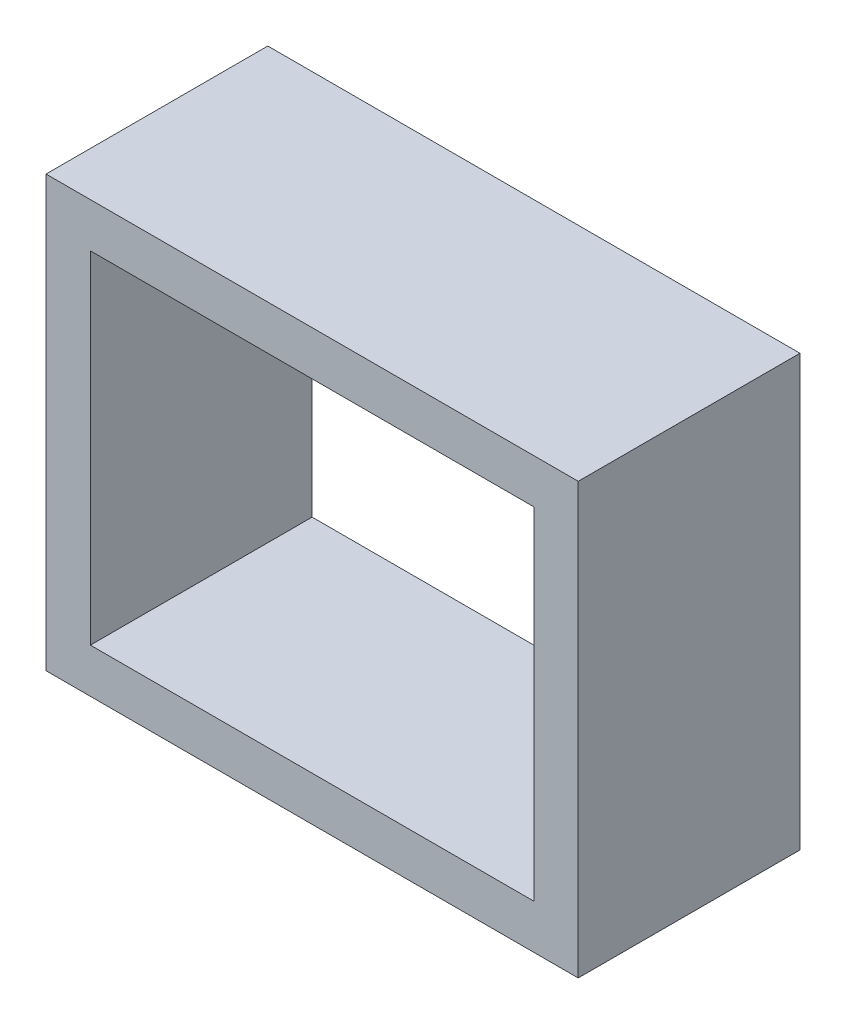
ISO-10303-21;
HEADER;
FILE_DESCRIPTION(('STEP AP214'),'2;1');
FILE_NAME('part.step','',(''),(''),'','','');
FILE_SCHEMA(('AUTOMOTIVE_DESIGN { 1 0 10303 214 1 1 1 1 }'));
ENDSEC;
DATA;
#1=APPLICATION_CONTEXT('core data for automotive mechanical design processes');
#2=APPLICATION_PROTOCOL_DEFINITION('international standard','automotive_design',2000,#1);
#3=PRODUCT_CONTEXT('',#1,'mechanical');
#4=PRODUCT('Part','Part','',(#3));
#5=PRODUCT_RELATED_PRODUCT_CATEGORY('part','',(#4));
#6=PRODUCT_DEFINITION_FORMATION('','',#4);
#7=PRODUCT_DEFINITION_CONTEXT('part definition',#1,'design');
#8=PRODUCT_DEFINITION('design','',#6,#7);
#9=PRODUCT_DEFINITION_SHAPE('','',#8);
#10=(LENGTH_UNIT() NAMED_UNIT(*) SI_UNIT(.MILLI.,.METRE.));
#11=(NAMED_UNIT(*) PLANE_ANGLE_UNIT() SI_UNIT($,.RADIAN.));
#12=(NAMED_UNIT(*) SI_UNIT($,.STERADIAN.) SOLID_ANGLE_UNIT());
#13=UNCERTAINTY_MEASURE_WITH_UNIT(LENGTH_MEASURE(1.E-05),#10,'distance_accuracy_value','');
#14=(GEOMETRIC_REPRESENTATION_CONTEXT(3) GLOBAL_UNCERTAINTY_ASSIGNED_CONTEXT((#13)) GLOBAL_UNIT_ASSIGNED_CONTEXT((#10,
#11,#12)) REPRESENTATION_CONTEXT('',''));
#15=CARTESIAN_POINT('',(0.,0.,0.));
#16=DIRECTION('',(0.,0.,1.));
#17=DIRECTION('',(1.,0.,0.));
#18=AXIS2_PLACEMENT_3D('',#15,#16,#17);
#19=CARTESIAN_POINT('',(0.,0.,50.));
#20=DIRECTION('',(0.,0.,1.));
#21=DIRECTION('',(1.,0.,0.));
#22=AXIS2_PLACEMENT_3D('',#19,#20,#21);
#23=PLANE('',#22);
#24=DIRECTION('',(0.,-1.,0.));
#25=VECTOR('',#24,1.);
#26=CARTESIAN_POINT('',(-60.,36.6666666666667,50.));
#27=LINE('',#26,#25);
#28=CARTESIAN_POINT('',(-60.,46.6666666666667,50.));
#29=VERTEX_POINT('',#28);
#30=CARTESIAN_POINT('',(-60.,-50.3333333333333,50.));
#31=VERTEX_POINT('',#30);
#32=EDGE_CURVE('E157',#29,#31,#27,.T.);
#33=ORIENTED_EDGE('',*,*,#32,.T.);
#34=DIRECTION('',(1.,0.,0.));
#35=VECTOR('',#34,1.);
#36=CARTESIAN_POINT('',(-50.,-50.3333333333333,50.));
#37=LINE('',#36,#35);
#38=CARTESIAN_POINT('',(60.,-50.3333333333333,50.));
#39=VERTEX_POINT('',#38);
#40=EDGE_CURVE('E160',#31,#39,#37,.T.);
#41=ORIENTED_EDGE('',*,*,#40,.T.);
#42=DIRECTION('',(0.,1.,0.));
#43=VECTOR('',#42,1.);
#44=CARTESIAN_POINT('',(60.,36.6666666666667,50.));
#45=LINE('',#44,#43);
#46=CARTESIAN_POINT('',(60.,46.6666666666667,50.));
#47=VERTEX_POINT('',#46);
#48=EDGE_CURVE('E163',#39,#47,#45,.T.);
#49=ORIENTED_EDGE('',*,*,#48,.T.);
#50=DIRECTION('',(-1.,0.,0.));
#51=VECTOR('',#50,1.);
#52=CARTESIAN_POINT('',(-50.,46.6666666666667,50.));
#53=LINE('',#52,#51);
#54=EDGE_CURVE('E165',#47,#29,#53,.T.);
#55=ORIENTED_EDGE('',*,*,#54,.T.);
#56=EDGE_LOOP('',(#33,#41,#49,#55));
#57=FACE_BOUND('',#56,.T.);
#58=DIRECTION('',(1.,0.,0.));
#59=VECTOR('',#58,1.);
#60=CARTESIAN_POINT('',(-50.,-40.3333333333333,50.));
#61=LINE('',#60,#59);
#62=CARTESIAN_POINT('',(-50.,-40.3333333333333,50.));
#63=VERTEX_POINT('',#62);
#64=CARTESIAN_POINT('',(50.,-40.3333333333333,50.));
#65=VERTEX_POINT('',#64);
#66=EDGE_CURVE('E129',#63,#65,#61,.T.);
#67=ORIENTED_EDGE('',*,*,#66,.F.);
#68=DIRECTION('',(0.,-1.,0.));
#69=VECTOR('',#68,1.);
#70=CARTESIAN_POINT('',(-50.,36.6666666666667,50.));
#71=LINE('',#70,#69);
#72=CARTESIAN_POINT('',(-50.,36.6666666666667,50.));
#73=VERTEX_POINT('',#72);
#74=EDGE_CURVE('E121',#73,#63,#71,.T.);
#75=ORIENTED_EDGE('',*,*,#74,.F.);
#76=DIRECTION('',(-1.,0.,0.));
#77=VECTOR('',#76,1.);
#78=CARTESIAN_POINT('',(-50.,36.6666666666667,50.));
#79=LINE('',#78,#77);
#80=CARTESIAN_POINT('',(50.,36.6666666666667,50.));
#81=VERTEX_POINT('',#80);
#82=EDGE_CURVE('E143',#81,#73,#79,.T.);
#83=ORIENTED_EDGE('',*,*,#82,.F.);
#84=DIRECTION('',(0.,1.,0.));
#85=VECTOR('',#84,1.);
#86=CARTESIAN_POINT('',(50.,36.6666666666667,50.));
#87=LINE('',#86,#85);
#88=EDGE_CURVE('E141',#65,#81,#87,.T.);
#89=ORIENTED_EDGE('',*,*,#88,.F.);
#90=EDGE_LOOP('',(#67,#75,#83,#89));
#91=FACE_BOUND('',#90,.T.);
#92=ADVANCED_FACE('F56',(#57,#91),#23,.T.);
#93=CARTESIAN_POINT('',(0.,0.,0.));
#94=DIRECTION('',(0.,0.,1.));
#95=DIRECTION('',(1.,0.,0.));
#96=AXIS2_PLACEMENT_3D('',#93,#94,#95);
#97=PLANE('',#96);
#98=DIRECTION('',(0.,-1.,0.));
#99=VECTOR('',#98,1.);
#100=CARTESIAN_POINT('',(-60.,36.6666666666667,0.));
#101=LINE('',#100,#99);
#102=CARTESIAN_POINT('',(-60.,46.6666666666667,0.));
#103=VERTEX_POINT('',#102);
#104=CARTESIAN_POINT('',(-60.,-50.3333333333333,0.));
#105=VERTEX_POINT('',#104);
#106=EDGE_CURVE('E137',#103,#105,#101,.T.);
#107=ORIENTED_EDGE('',*,*,#106,.F.);
#108=DIRECTION('',(-1.,0.,0.));
#109=VECTOR('',#108,1.);
#110=CARTESIAN_POINT('',(-50.,46.6666666666667,0.));
#111=LINE('',#110,#109);
#112=CARTESIAN_POINT('',(60.,46.6666666666667,0.));
#113=VERTEX_POINT('',#112);
#114=EDGE_CURVE('E161',#113,#103,#111,.T.);
#115=ORIENTED_EDGE('',*,*,#114,.F.);
#116=DIRECTION('',(0.,1.,0.));
#117=VECTOR('',#116,1.);
#118=CARTESIAN_POINT('',(60.,36.6666666666667,0.));
#119=LINE('',#118,#117);
#120=CARTESIAN_POINT('',(60.,-50.3333333333333,0.));
#121=VERTEX_POINT('',#120);
#122=EDGE_CURVE('E172',#121,#113,#119,.T.);
#123=ORIENTED_EDGE('',*,*,#122,.F.);
#124=DIRECTION('',(1.,0.,0.));
#125=VECTOR('',#124,1.);
#126=CARTESIAN_POINT('',(-50.,-50.3333333333333,0.));
#127=LINE('',#126,#125);
#128=EDGE_CURVE('E170',#105,#121,#127,.T.);
#129=ORIENTED_EDGE('',*,*,#128,.F.);
#130=EDGE_LOOP('',(#107,#115,#123,#129));
#131=FACE_BOUND('',#130,.T.);
#132=DIRECTION('',(0.,-1.,0.));
#133=VECTOR('',#132,1.);
#134=CARTESIAN_POINT('',(-50.,36.6666666666667,0.));
#135=LINE('',#134,#133);
#136=CARTESIAN_POINT('',(-50.,36.6666666666667,0.));
#137=VERTEX_POINT('',#136);
#138=CARTESIAN_POINT('',(-50.,-40.3333333333333,0.));
#139=VERTEX_POINT('',#138);
#140=EDGE_CURVE('E79',#137,#139,#135,.T.);
#141=ORIENTED_EDGE('',*,*,#140,.T.);
#142=DIRECTION('',(1.,0.,0.));
#143=VECTOR('',#142,1.);
#144=CARTESIAN_POINT('',(-50.,-40.3333333333333,0.));
#145=LINE('',#144,#143);
#146=CARTESIAN_POINT('',(50.,-40.3333333333333,0.));
#147=VERTEX_POINT('',#146);
#148=EDGE_CURVE('E136',#139,#147,#145,.T.);
#149=ORIENTED_EDGE('',*,*,#148,.T.);
#150=DIRECTION('',(0.,1.,0.));
#151=VECTOR('',#150,1.);
#152=CARTESIAN_POINT('',(50.,36.6666666666667,0.));
#153=LINE('',#152,#151);
#154=CARTESIAN_POINT('',(50.,36.6666666666667,0.));
#155=VERTEX_POINT('',#154);
#156=EDGE_CURVE('E149',#147,#155,#153,.T.);
#157=ORIENTED_EDGE('',*,*,#156,.T.);
#158=DIRECTION('',(-1.,0.,0.));
#159=VECTOR('',#158,1.);
#160=CARTESIAN_POINT('',(-50.,36.6666666666667,0.));
#161=LINE('',#160,#159);
#162=EDGE_CURVE('E130',#155,#137,#161,.T.);
#163=ORIENTED_EDGE('',*,*,#162,.T.);
#164=EDGE_LOOP('',(#141,#149,#157,#163));
#165=FACE_BOUND('',#164,.T.);
#166=ADVANCED_FACE('F190',(#131,#165),#97,.F.);
#167=CARTESIAN_POINT('',(-60.,36.6666666666667,50.));
#168=DIRECTION('',(1.,0.,0.));
#169=DIRECTION('',(0.,1.,0.));
#170=AXIS2_PLACEMENT_3D('',#167,#168,#169);
#171=PLANE('',#170);
#172=ORIENTED_EDGE('',*,*,#106,.T.);
#173=DIRECTION('',(0.,0.,-1.));
#174=VECTOR('',#173,1.);
#175=CARTESIAN_POINT('',(-60.,-50.3333333333333,50.));
#176=LINE('',#175,#174);
#177=EDGE_CURVE('E12',#31,#105,#176,.T.);
#178=ORIENTED_EDGE('',*,*,#177,.F.);
#179=ORIENTED_EDGE('',*,*,#32,.F.);
#180=DIRECTION('',(0.,0.,-1.));
#181=VECTOR('',#180,1.);
#182=CARTESIAN_POINT('',(-60.,46.6666666666667,50.));
#183=LINE('',#182,#181);
#184=EDGE_CURVE('E167',#29,#103,#183,.T.);
#185=ORIENTED_EDGE('',*,*,#184,.T.);
#186=EDGE_LOOP('',(#172,#178,#179,#185));
#187=FACE_BOUND('',#186,.T.);
#188=ADVANCED_FACE('F58',(#187),#171,.F.);
#189=CARTESIAN_POINT('',(-50.,-50.3333333333333,50.));
#190=DIRECTION('',(0.,1.,0.));
#191=DIRECTION('',(0.,0.,1.));
#192=AXIS2_PLACEMENT_3D('',#189,#190,#191);
#193=PLANE('',#192);
#194=ORIENTED_EDGE('',*,*,#128,.T.);
#195=DIRECTION('',(0.,0.,-1.));
#196=VECTOR('',#195,1.);
#197=CARTESIAN_POINT('',(60.,-50.3333333333333,50.));
#198=LINE('',#197,#196);
#199=EDGE_CURVE('E64',#39,#121,#198,.T.);
#200=ORIENTED_EDGE('',*,*,#199,.F.);
#201=ORIENTED_EDGE('',*,*,#40,.F.);
#202=ORIENTED_EDGE('',*,*,#177,.T.);
#203=EDGE_LOOP('',(#194,#200,#201,#202));
#204=FACE_BOUND('',#203,.T.);
#205=ADVANCED_FACE('F200',(#204),#193,.F.);
#206=CARTESIAN_POINT('',(60.,36.6666666666667,50.));
#207=DIRECTION('',(-1.,0.,0.));
#208=DIRECTION('',(0.,-1.,0.));
#209=AXIS2_PLACEMENT_3D('',#206,#207,#208);
#210=PLANE('',#209);
#211=ORIENTED_EDGE('',*,*,#122,.T.);
#212=DIRECTION('',(0.,0.,-1.));
#213=VECTOR('',#212,1.);
#214=CARTESIAN_POINT('',(60.,46.6666666666667,50.));
#215=LINE('',#214,#213);
#216=EDGE_CURVE('E177',#47,#113,#215,.T.);
#217=ORIENTED_EDGE('',*,*,#216,.F.);
#218=ORIENTED_EDGE('',*,*,#48,.F.);
#219=ORIENTED_EDGE('',*,*,#199,.T.);
#220=EDGE_LOOP('',(#211,#217,#218,#219));
#221=FACE_BOUND('',#220,.T.);
#222=ADVANCED_FACE('F184',(#221),#210,.F.);
#223=CARTESIAN_POINT('',(-50.,46.6666666666667,50.));
#224=DIRECTION('',(0.,-1.,0.));
#225=DIRECTION('',(0.,0.,-1.));
#226=AXIS2_PLACEMENT_3D('',#223,#224,#225);
#227=PLANE('',#226);
#228=ORIENTED_EDGE('',*,*,#114,.T.);
#229=ORIENTED_EDGE('',*,*,#184,.F.);
#230=ORIENTED_EDGE('',*,*,#54,.F.);
#231=ORIENTED_EDGE('',*,*,#216,.T.);
#232=EDGE_LOOP('',(#228,#229,#230,#231));
#233=FACE_BOUND('',#232,.T.);
#234=ADVANCED_FACE('F194',(#233),#227,.F.);
#235=CARTESIAN_POINT('',(-50.,36.6666666666667,50.));
#236=DIRECTION('',(1.,0.,0.));
#237=DIRECTION('',(0.,1.,0.));
#238=AXIS2_PLACEMENT_3D('',#235,#236,#237);
#239=PLANE('',#238);
#240=ORIENTED_EDGE('',*,*,#140,.F.);
#241=DIRECTION('',(0.,0.,-1.));
#242=VECTOR('',#241,1.);
#243=CARTESIAN_POINT('',(-50.,36.6666666666667,50.));
#244=LINE('',#243,#242);
#245=EDGE_CURVE('E125',#73,#137,#244,.T.);
#246=ORIENTED_EDGE('',*,*,#245,.F.);
#247=ORIENTED_EDGE('',*,*,#74,.T.);
#248=DIRECTION('',(0.,0.,-1.));
#249=VECTOR('',#248,1.);
#250=CARTESIAN_POINT('',(-50.,-40.3333333333333,50.));
#251=LINE('',#250,#249);
#252=EDGE_CURVE('E124',#63,#139,#251,.T.);
#253=ORIENTED_EDGE('',*,*,#252,.T.);
#254=EDGE_LOOP('',(#240,#246,#247,#253));
#255=FACE_BOUND('',#254,.T.);
#256=ADVANCED_FACE('F123',(#255),#239,.T.);
#257=CARTESIAN_POINT('',(-50.,-40.3333333333333,50.));
#258=DIRECTION('',(0.,1.,0.));
#259=DIRECTION('',(0.,0.,1.));
#260=AXIS2_PLACEMENT_3D('',#257,#258,#259);
#261=PLANE('',#260);
#262=ORIENTED_EDGE('',*,*,#148,.F.);
#263=ORIENTED_EDGE('',*,*,#252,.F.);
#264=ORIENTED_EDGE('',*,*,#66,.T.);
#265=DIRECTION('',(0.,0.,-1.));
#266=VECTOR('',#265,1.);
#267=CARTESIAN_POINT('',(50.,-40.3333333333333,50.));
#268=LINE('',#267,#266);
#269=EDGE_CURVE('E138',#65,#147,#268,.T.);
#270=ORIENTED_EDGE('',*,*,#269,.T.);
#271=EDGE_LOOP('',(#262,#263,#264,#270));
#272=FACE_BOUND('',#271,.T.);
#273=ADVANCED_FACE('F133',(#272),#261,.T.);
#274=CARTESIAN_POINT('',(50.,36.6666666666667,50.));
#275=DIRECTION('',(-1.,0.,0.));
#276=DIRECTION('',(0.,-1.,0.));
#277=AXIS2_PLACEMENT_3D('',#274,#275,#276);
#278=PLANE('',#277);
#279=ORIENTED_EDGE('',*,*,#156,.F.);
#280=ORIENTED_EDGE('',*,*,#269,.F.);
#281=ORIENTED_EDGE('',*,*,#88,.T.);
#282=DIRECTION('',(0.,0.,-1.));
#283=VECTOR('',#282,1.);
#284=CARTESIAN_POINT('',(50.,36.6666666666667,50.));
#285=LINE('',#284,#283);
#286=EDGE_CURVE('E71',#81,#155,#285,.T.);
#287=ORIENTED_EDGE('',*,*,#286,.T.);
#288=EDGE_LOOP('',(#279,#280,#281,#287));
#289=FACE_BOUND('',#288,.T.);
#290=ADVANCED_FACE('F223',(#289),#278,.T.);
#291=CARTESIAN_POINT('',(-50.,36.6666666666667,50.));
#292=DIRECTION('',(0.,-1.,0.));
#293=DIRECTION('',(0.,0.,-1.));
#294=AXIS2_PLACEMENT_3D('',#291,#292,#293);
#295=PLANE('',#294);
#296=ORIENTED_EDGE('',*,*,#162,.F.);
#297=ORIENTED_EDGE('',*,*,#286,.F.);
#298=ORIENTED_EDGE('',*,*,#82,.T.);
#299=ORIENTED_EDGE('',*,*,#245,.T.);
#300=EDGE_LOOP('',(#296,#297,#298,#299));
#301=FACE_BOUND('',#300,.T.);
#302=ADVANCED_FACE('F227',(#301),#295,.T.);
#303=CLOSED_SHELL('',(#92,#166,#188,#205,#222,#234,#256,#273,#290,#302));
#304=MANIFOLD_SOLID_BREP('B2',#303);
#305=ADVANCED_BREP_SHAPE_REPRESENTATION('',(#18,#304),#14);
#306=SHAPE_DEFINITION_REPRESENTATION(#9,#305);
ENDSEC;
END-ISO-10303-21;
